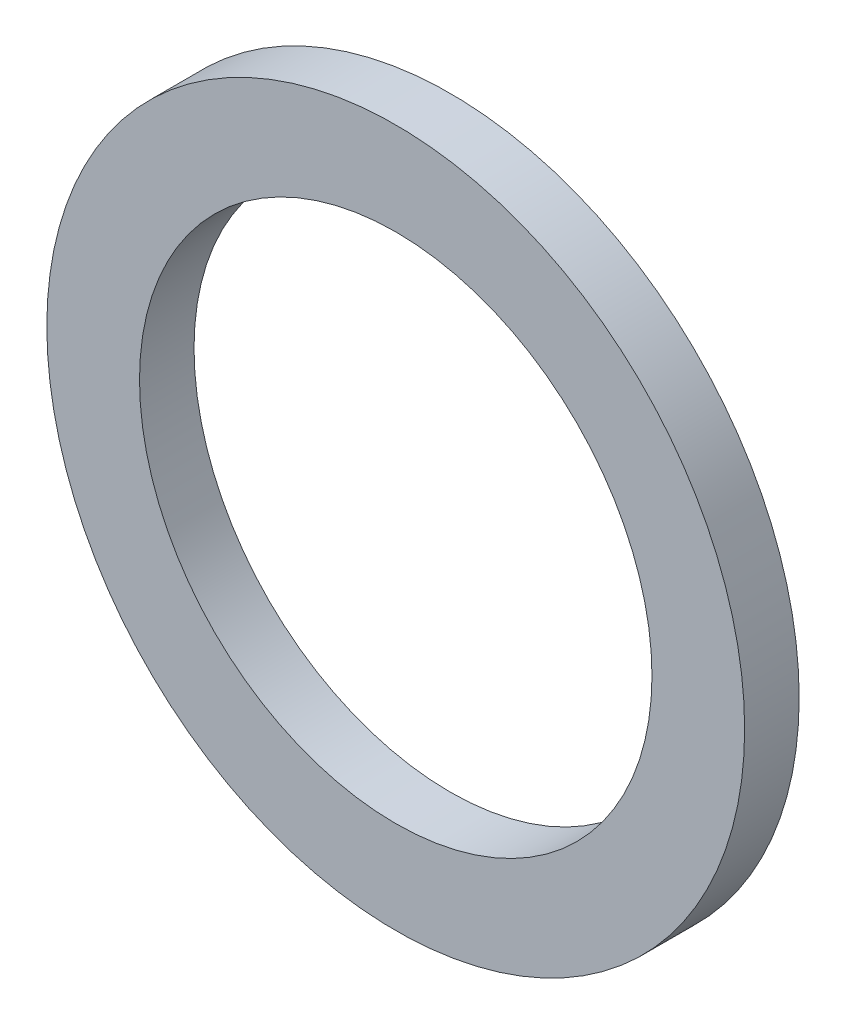
ISO-10303-21;
HEADER;
FILE_DESCRIPTION(('STEP AP214'),'2;1');
FILE_NAME('part.step','',(''),(''),'','','');
FILE_SCHEMA(('AUTOMOTIVE_DESIGN { 1 0 10303 214 1 1 1 1 }'));
ENDSEC;
DATA;
#1=APPLICATION_CONTEXT('core data for automotive mechanical design processes');
#2=APPLICATION_PROTOCOL_DEFINITION('international standard','automotive_design',2000,#1);
#3=PRODUCT_CONTEXT('',#1,'mechanical');
#4=PRODUCT('Part','Part','',(#3));
#5=PRODUCT_RELATED_PRODUCT_CATEGORY('part','',(#4));
#6=PRODUCT_DEFINITION_FORMATION('','',#4);
#7=PRODUCT_DEFINITION_CONTEXT('part definition',#1,'design');
#8=PRODUCT_DEFINITION('design','',#6,#7);
#9=PRODUCT_DEFINITION_SHAPE('','',#8);
#10=(LENGTH_UNIT() NAMED_UNIT(*) SI_UNIT(.MILLI.,.METRE.));
#11=(NAMED_UNIT(*) PLANE_ANGLE_UNIT() SI_UNIT($,.RADIAN.));
#12=(NAMED_UNIT(*) SI_UNIT($,.STERADIAN.) SOLID_ANGLE_UNIT());
#13=UNCERTAINTY_MEASURE_WITH_UNIT(LENGTH_MEASURE(1.E-05),#10,'distance_accuracy_value','');
#14=(GEOMETRIC_REPRESENTATION_CONTEXT(3) GLOBAL_UNCERTAINTY_ASSIGNED_CONTEXT((#13)) GLOBAL_UNIT_ASSIGNED_CONTEXT((#10,
#11,#12)) REPRESENTATION_CONTEXT('',''));
#15=CARTESIAN_POINT('',(0.,0.,0.));
#16=DIRECTION('',(0.,0.,1.));
#17=DIRECTION('',(1.,0.,0.));
#18=AXIS2_PLACEMENT_3D('',#15,#16,#17);
#19=CARTESIAN_POINT('',(0.,0.,0.5));
#20=DIRECTION('',(0.,0.,1.));
#21=DIRECTION('',(1.,0.,0.));
#22=AXIS2_PLACEMENT_3D('',#19,#20,#21);
#23=PLANE('',#22);
#24=CARTESIAN_POINT('',(0.,0.,0.5));
#25=DIRECTION('',(0.,0.,1.));
#26=DIRECTION('',(1.,0.,0.));
#27=AXIS2_PLACEMENT_3D('',#24,#25,#26);
#28=CIRCLE('',#27,3.2);
#29=CARTESIAN_POINT('',(3.2,0.,0.5));
#30=VERTEX_POINT('',#29);
#31=EDGE_CURVE('E10',#30,#30,#28,.T.);
#32=ORIENTED_EDGE('',*,*,#31,.T.);
#33=EDGE_LOOP('',(#32));
#34=FACE_BOUND('',#33,.T.);
#35=CARTESIAN_POINT('',(0.,0.,0.5));
#36=DIRECTION('',(0.,0.,1.));
#37=DIRECTION('',(1.,0.,0.));
#38=AXIS2_PLACEMENT_3D('',#35,#36,#37);
#39=CIRCLE('',#38,2.35);
#40=CARTESIAN_POINT('',(2.35,0.,0.5));
#41=VERTEX_POINT('',#40);
#42=EDGE_CURVE('E52',#41,#41,#39,.T.);
#43=ORIENTED_EDGE('',*,*,#42,.F.);
#44=EDGE_LOOP('',(#43));
#45=FACE_BOUND('',#44,.T.);
#46=ADVANCED_FACE('F39',(#34,#45),#23,.T.);
#47=CARTESIAN_POINT('',(0.,0.,0.));
#48=DIRECTION('',(0.,0.,1.));
#49=DIRECTION('',(1.,0.,0.));
#50=AXIS2_PLACEMENT_3D('',#47,#48,#49);
#51=PLANE('',#50);
#52=CARTESIAN_POINT('',(0.,0.,0.));
#53=DIRECTION('',(0.,0.,1.));
#54=DIRECTION('',(1.,0.,0.));
#55=AXIS2_PLACEMENT_3D('',#52,#53,#54);
#56=CIRCLE('',#55,3.2);
#57=CARTESIAN_POINT('',(3.2,0.,0.));
#58=VERTEX_POINT('',#57);
#59=EDGE_CURVE('E43',#58,#58,#56,.T.);
#60=ORIENTED_EDGE('',*,*,#59,.F.);
#61=EDGE_LOOP('',(#60));
#62=FACE_BOUND('',#61,.T.);
#63=CARTESIAN_POINT('',(0.,0.,0.));
#64=DIRECTION('',(0.,0.,1.));
#65=DIRECTION('',(1.,0.,0.));
#66=AXIS2_PLACEMENT_3D('',#63,#64,#65);
#67=CIRCLE('',#66,2.35);
#68=CARTESIAN_POINT('',(2.35,0.,0.));
#69=VERTEX_POINT('',#68);
#70=EDGE_CURVE('E54',#69,#69,#67,.T.);
#71=ORIENTED_EDGE('',*,*,#70,.T.);
#72=EDGE_LOOP('',(#71));
#73=FACE_BOUND('',#72,.T.);
#74=ADVANCED_FACE('F66',(#62,#73),#51,.F.);
#75=CARTESIAN_POINT('',(0.,0.,0.5));
#76=DIRECTION('',(0.,0.,-1.));
#77=DIRECTION('',(-1.,0.,0.));
#78=AXIS2_PLACEMENT_3D('',#75,#76,#77);
#79=CYLINDRICAL_SURFACE('',#78,3.2);
#80=ORIENTED_EDGE('',*,*,#31,.F.);
#81=EDGE_LOOP('',(#80));
#82=FACE_BOUND('',#81,.T.);
#83=ORIENTED_EDGE('',*,*,#59,.T.);
#84=EDGE_LOOP('',(#83));
#85=FACE_BOUND('',#84,.T.);
#86=ADVANCED_FACE('F41',(#82,#85),#79,.T.);
#87=CARTESIAN_POINT('',(0.,0.,0.5));
#88=DIRECTION('',(0.,0.,-1.));
#89=DIRECTION('',(-1.,0.,0.));
#90=AXIS2_PLACEMENT_3D('',#87,#88,#89);
#91=CYLINDRICAL_SURFACE('',#90,2.35);
#92=ORIENTED_EDGE('',*,*,#42,.T.);
#93=EDGE_LOOP('',(#92));
#94=FACE_BOUND('',#93,.T.);
#95=ORIENTED_EDGE('',*,*,#70,.F.);
#96=EDGE_LOOP('',(#95));
#97=FACE_BOUND('',#96,.T.);
#98=ADVANCED_FACE('F62',(#94,#97),#91,.F.);
#99=CLOSED_SHELL('',(#46,#74,#86,#98));
#100=MANIFOLD_SOLID_BREP('B2',#99);
#101=ADVANCED_BREP_SHAPE_REPRESENTATION('',(#18,#100),#14);
#102=SHAPE_DEFINITION_REPRESENTATION(#9,#101);
ENDSEC;
END-ISO-10303-21;
